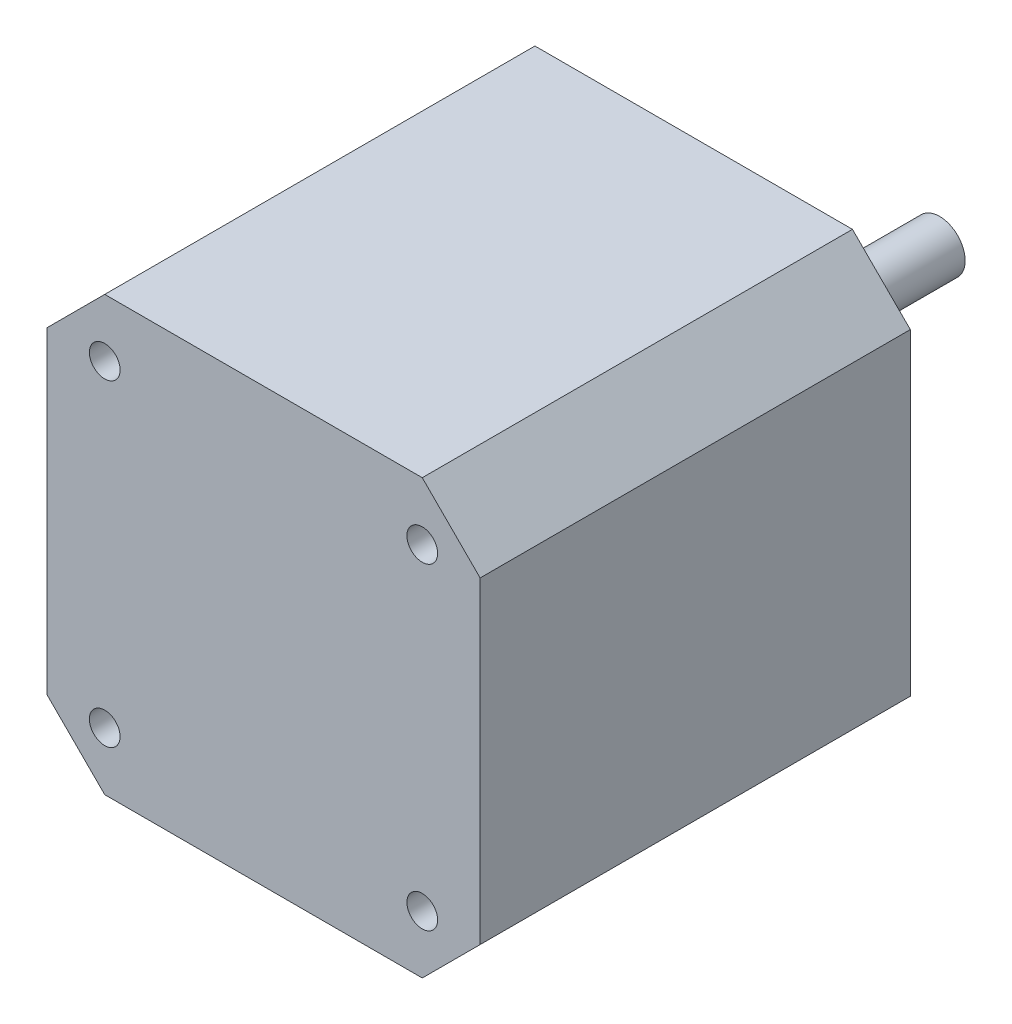
ISO-10303-21;
HEADER;
FILE_DESCRIPTION(('STEP AP214'),'2;1');
FILE_NAME('part.step','',(''),(''),'','','');
FILE_SCHEMA(('AUTOMOTIVE_DESIGN { 1 0 10303 214 1 1 1 1 }'));
ENDSEC;
DATA;
#1=APPLICATION_CONTEXT('core data for automotive mechanical design processes');
#2=APPLICATION_PROTOCOL_DEFINITION('international standard','automotive_design',2000,#1);
#3=PRODUCT_CONTEXT('',#1,'mechanical');
#4=PRODUCT('Part','Part','',(#3));
#5=PRODUCT_RELATED_PRODUCT_CATEGORY('part','',(#4));
#6=PRODUCT_DEFINITION_FORMATION('','',#4);
#7=PRODUCT_DEFINITION_CONTEXT('part definition',#1,'design');
#8=PRODUCT_DEFINITION('design','',#6,#7);
#9=PRODUCT_DEFINITION_SHAPE('','',#8);
#10=(LENGTH_UNIT() NAMED_UNIT(*) SI_UNIT(.MILLI.,.METRE.));
#11=(NAMED_UNIT(*) PLANE_ANGLE_UNIT() SI_UNIT($,.RADIAN.));
#12=(NAMED_UNIT(*) SI_UNIT($,.STERADIAN.) SOLID_ANGLE_UNIT());
#13=UNCERTAINTY_MEASURE_WITH_UNIT(LENGTH_MEASURE(1.E-05),#10,'distance_accuracy_value','');
#14=(GEOMETRIC_REPRESENTATION_CONTEXT(3) GLOBAL_UNCERTAINTY_ASSIGNED_CONTEXT((#13)) GLOBAL_UNIT_ASSIGNED_CONTEXT((#10,
#11,#12)) REPRESENTATION_CONTEXT('',''));
#15=CARTESIAN_POINT('',(0.,0.,0.));
#16=DIRECTION('',(0.,0.,1.));
#17=DIRECTION('',(1.,0.,0.));
#18=AXIS2_PLACEMENT_3D('',#15,#16,#17);
#19=CARTESIAN_POINT('',(0.,0.,42.));
#20=DIRECTION('',(0.,0.,1.));
#21=DIRECTION('',(1.,0.,0.));
#22=AXIS2_PLACEMENT_3D('',#19,#20,#21);
#23=PLANE('',#22);
#24=CARTESIAN_POINT('',(-15.4999999999991,-15.5000000000009,42.));
#25=DIRECTION('',(0.,0.,1.));
#26=DIRECTION('',(1.,0.,0.));
#27=AXIS2_PLACEMENT_3D('',#24,#25,#26);
#28=CIRCLE('',#27,1.50000000000065);
#29=CARTESIAN_POINT('',(-13.9999999999985,-15.5000000000009,42.));
#30=VERTEX_POINT('',#29);
#31=EDGE_CURVE('E192',#30,#30,#28,.T.);
#32=ORIENTED_EDGE('',*,*,#31,.F.);
#33=EDGE_LOOP('',(#32));
#34=FACE_BOUND('',#33,.T.);
#35=CARTESIAN_POINT('',(15.5,15.5,42.));
#36=DIRECTION('',(0.,0.,1.));
#37=DIRECTION('',(1.,0.,0.));
#38=AXIS2_PLACEMENT_3D('',#35,#36,#37);
#39=CIRCLE('',#38,1.5);
#40=CARTESIAN_POINT('',(17.,15.5,42.));
#41=VERTEX_POINT('',#40);
#42=EDGE_CURVE('E138',#41,#41,#39,.T.);
#43=ORIENTED_EDGE('',*,*,#42,.F.);
#44=EDGE_LOOP('',(#43));
#45=FACE_BOUND('',#44,.T.);
#46=DIRECTION('',(-1.,0.,0.));
#47=VECTOR('',#46,1.);
#48=CARTESIAN_POINT('',(-15.5000000000006,21.1499999999994,42.));
#49=LINE('',#48,#47);
#50=CARTESIAN_POINT('',(15.5000000000006,21.1499999999994,42.));
#51=VERTEX_POINT('',#50);
#52=CARTESIAN_POINT('',(-15.5000000000006,21.1499999999994,42.));
#53=VERTEX_POINT('',#52);
#54=EDGE_CURVE('E149',#51,#53,#49,.T.);
#55=ORIENTED_EDGE('',*,*,#54,.T.);
#56=DIRECTION('',(-0.707106781186547,-0.707106781186548,0.));
#57=VECTOR('',#56,1.);
#58=CARTESIAN_POINT('',(-15.5000000000006,21.1499999999994,42.));
#59=LINE('',#58,#57);
#60=CARTESIAN_POINT('',(-21.1499999999993,15.5000000000006,42.));
#61=VERTEX_POINT('',#60);
#62=EDGE_CURVE('E97',#53,#61,#59,.T.);
#63=ORIENTED_EDGE('',*,*,#62,.T.);
#64=DIRECTION('',(0.,-1.,0.));
#65=VECTOR('',#64,1.);
#66=CARTESIAN_POINT('',(-21.1499999999993,-15.5000000000006,42.));
#67=LINE('',#66,#65);
#68=CARTESIAN_POINT('',(-21.1499999999993,-15.5000000000006,42.));
#69=VERTEX_POINT('',#68);
#70=EDGE_CURVE('E164',#61,#69,#67,.T.);
#71=ORIENTED_EDGE('',*,*,#70,.T.);
#72=DIRECTION('',(0.707106781186548,-0.707106781186547,0.));
#73=VECTOR('',#72,1.);
#74=CARTESIAN_POINT('',(-21.1499999999993,-15.5000000000006,42.));
#75=LINE('',#74,#73);
#76=CARTESIAN_POINT('',(-15.5000000000006,-21.1499999999993,42.));
#77=VERTEX_POINT('',#76);
#78=EDGE_CURVE('E177',#69,#77,#75,.T.);
#79=ORIENTED_EDGE('',*,*,#78,.T.);
#80=DIRECTION('',(1.,0.,0.));
#81=VECTOR('',#80,1.);
#82=CARTESIAN_POINT('',(-15.5000000000006,-21.1499999999993,42.));
#83=LINE('',#82,#81);
#84=CARTESIAN_POINT('',(15.5000000000006,-21.1499999999993,42.));
#85=VERTEX_POINT('',#84);
#86=EDGE_CURVE('E116',#77,#85,#83,.T.);
#87=ORIENTED_EDGE('',*,*,#86,.T.);
#88=DIRECTION('',(0.707106781186548,0.707106781186548,0.));
#89=VECTOR('',#88,1.);
#90=CARTESIAN_POINT('',(15.5000000000006,-21.1499999999993,42.));
#91=LINE('',#90,#89);
#92=CARTESIAN_POINT('',(21.1499999999994,-15.5000000000006,42.));
#93=VERTEX_POINT('',#92);
#94=EDGE_CURVE('E110',#85,#93,#91,.T.);
#95=ORIENTED_EDGE('',*,*,#94,.T.);
#96=DIRECTION('',(0.,1.,0.));
#97=VECTOR('',#96,1.);
#98=CARTESIAN_POINT('',(21.1499999999994,-15.5000000000006,42.));
#99=LINE('',#98,#97);
#100=CARTESIAN_POINT('',(21.1499999999994,15.5000000000006,42.));
#101=VERTEX_POINT('',#100);
#102=EDGE_CURVE('E114',#93,#101,#99,.T.);
#103=ORIENTED_EDGE('',*,*,#102,.T.);
#104=DIRECTION('',(-0.707106781186548,0.707106781186547,0.));
#105=VECTOR('',#104,1.);
#106=CARTESIAN_POINT('',(21.1499999999994,15.5000000000006,42.));
#107=LINE('',#106,#105);
#108=EDGE_CURVE('E54',#101,#51,#107,.T.);
#109=ORIENTED_EDGE('',*,*,#108,.T.);
#110=EDGE_LOOP('',(#55,#63,#71,#79,#87,#95,#103,#109));
#111=FACE_BOUND('',#110,.T.);
#112=CARTESIAN_POINT('',(15.5000000000009,-15.5,42.));
#113=DIRECTION('',(0.,0.,1.));
#114=DIRECTION('',(1.,0.,0.));
#115=AXIS2_PLACEMENT_3D('',#112,#113,#114);
#116=CIRCLE('',#115,1.49999999999978);
#117=CARTESIAN_POINT('',(17.0000000000007,-15.5,42.));
#118=VERTEX_POINT('',#117);
#119=EDGE_CURVE('E186',#118,#118,#116,.T.);
#120=ORIENTED_EDGE('',*,*,#119,.F.);
#121=EDGE_LOOP('',(#120));
#122=FACE_BOUND('',#121,.T.);
#123=CARTESIAN_POINT('',(-15.5,15.4999999999991,42.));
#124=DIRECTION('',(0.,0.,1.));
#125=DIRECTION('',(1.,0.,0.));
#126=AXIS2_PLACEMENT_3D('',#123,#124,#125);
#127=CIRCLE('',#126,1.50000000000094);
#128=CARTESIAN_POINT('',(-13.9999999999991,15.4999999999991,42.));
#129=VERTEX_POINT('',#128);
#130=EDGE_CURVE('E198',#129,#129,#127,.T.);
#131=ORIENTED_EDGE('',*,*,#130,.F.);
#132=EDGE_LOOP('',(#131));
#133=FACE_BOUND('',#132,.T.);
#134=ADVANCED_FACE('F37',(#34,#45,#111,#122,#133),#23,.T.);
#135=CARTESIAN_POINT('',(0.,0.,0.));
#136=DIRECTION('',(0.,0.,1.));
#137=DIRECTION('',(1.,0.,0.));
#138=AXIS2_PLACEMENT_3D('',#135,#136,#137);
#139=PLANE('',#138);
#140=CARTESIAN_POINT('',(0.,0.,0.));
#141=DIRECTION('',(0.,0.,1.));
#142=DIRECTION('',(1.,0.,0.));
#143=AXIS2_PLACEMENT_3D('',#140,#141,#142);
#144=CIRCLE('',#143,11.);
#145=CARTESIAN_POINT('',(11.,0.,0.));
#146=VERTEX_POINT('',#145);
#147=EDGE_CURVE('E204',#146,#146,#144,.T.);
#148=ORIENTED_EDGE('',*,*,#147,.T.);
#149=EDGE_LOOP('',(#148));
#150=FACE_BOUND('',#149,.T.);
#151=DIRECTION('',(-1.,0.,0.));
#152=VECTOR('',#151,1.);
#153=CARTESIAN_POINT('',(-15.5000000000006,21.1499999999994,0.));
#154=LINE('',#153,#152);
#155=CARTESIAN_POINT('',(15.5000000000006,21.1499999999994,0.));
#156=VERTEX_POINT('',#155);
#157=CARTESIAN_POINT('',(-15.5000000000006,21.1499999999994,0.));
#158=VERTEX_POINT('',#157);
#159=EDGE_CURVE('E134',#156,#158,#154,.T.);
#160=ORIENTED_EDGE('',*,*,#159,.F.);
#161=DIRECTION('',(-0.707106781186548,0.707106781186547,0.));
#162=VECTOR('',#161,1.);
#163=CARTESIAN_POINT('',(21.1499999999994,15.5000000000006,0.));
#164=LINE('',#163,#162);
#165=CARTESIAN_POINT('',(21.1499999999994,15.5000000000006,0.));
#166=VERTEX_POINT('',#165);
#167=EDGE_CURVE('E89',#166,#156,#164,.T.);
#168=ORIENTED_EDGE('',*,*,#167,.F.);
#169=DIRECTION('',(0.,1.,0.));
#170=VECTOR('',#169,1.);
#171=CARTESIAN_POINT('',(21.1499999999994,-15.5000000000006,0.));
#172=LINE('',#171,#170);
#173=CARTESIAN_POINT('',(21.1499999999994,-15.5000000000006,0.));
#174=VERTEX_POINT('',#173);
#175=EDGE_CURVE('E83',#174,#166,#172,.T.);
#176=ORIENTED_EDGE('',*,*,#175,.F.);
#177=DIRECTION('',(0.707106781186548,0.707106781186548,0.));
#178=VECTOR('',#177,1.);
#179=CARTESIAN_POINT('',(15.5000000000006,-21.1499999999993,0.));
#180=LINE('',#179,#178);
#181=CARTESIAN_POINT('',(15.5000000000006,-21.1499999999993,0.));
#182=VERTEX_POINT('',#181);
#183=EDGE_CURVE('E124',#182,#174,#180,.T.);
#184=ORIENTED_EDGE('',*,*,#183,.F.);
#185=DIRECTION('',(1.,0.,0.));
#186=VECTOR('',#185,1.);
#187=CARTESIAN_POINT('',(-15.5000000000006,-21.1499999999993,0.));
#188=LINE('',#187,#186);
#189=CARTESIAN_POINT('',(-15.5000000000006,-21.1499999999993,0.));
#190=VERTEX_POINT('',#189);
#191=EDGE_CURVE('E144',#190,#182,#188,.T.);
#192=ORIENTED_EDGE('',*,*,#191,.F.);
#193=DIRECTION('',(0.707106781186548,-0.707106781186547,0.));
#194=VECTOR('',#193,1.);
#195=CARTESIAN_POINT('',(-21.1499999999993,-15.5000000000006,0.));
#196=LINE('',#195,#194);
#197=CARTESIAN_POINT('',(-21.1499999999993,-15.5000000000006,0.));
#198=VERTEX_POINT('',#197);
#199=EDGE_CURVE('E142',#198,#190,#196,.T.);
#200=ORIENTED_EDGE('',*,*,#199,.F.);
#201=DIRECTION('',(0.,-1.,0.));
#202=VECTOR('',#201,1.);
#203=CARTESIAN_POINT('',(-21.1499999999993,-15.5000000000006,0.));
#204=LINE('',#203,#202);
#205=CARTESIAN_POINT('',(-21.1499999999993,15.5000000000006,0.));
#206=VERTEX_POINT('',#205);
#207=EDGE_CURVE('E140',#206,#198,#204,.T.);
#208=ORIENTED_EDGE('',*,*,#207,.F.);
#209=DIRECTION('',(-0.707106781186547,-0.707106781186548,0.));
#210=VECTOR('',#209,1.);
#211=CARTESIAN_POINT('',(-15.5000000000006,21.1499999999994,0.));
#212=LINE('',#211,#210);
#213=EDGE_CURVE('E137',#158,#206,#212,.T.);
#214=ORIENTED_EDGE('',*,*,#213,.F.);
#215=EDGE_LOOP('',(#160,#168,#176,#184,#192,#200,#208,#214));
#216=FACE_BOUND('',#215,.T.);
#217=CARTESIAN_POINT('',(15.5,15.5,0.));
#218=DIRECTION('',(0.,0.,1.));
#219=DIRECTION('',(1.,0.,0.));
#220=AXIS2_PLACEMENT_3D('',#217,#218,#219);
#221=CIRCLE('',#220,1.5);
#222=CARTESIAN_POINT('',(17.,15.5,0.));
#223=VERTEX_POINT('',#222);
#224=EDGE_CURVE('E183',#223,#223,#221,.T.);
#225=ORIENTED_EDGE('',*,*,#224,.T.);
#226=EDGE_LOOP('',(#225));
#227=FACE_BOUND('',#226,.T.);
#228=CARTESIAN_POINT('',(15.5000000000009,-15.5,0.));
#229=DIRECTION('',(0.,0.,1.));
#230=DIRECTION('',(1.,0.,0.));
#231=AXIS2_PLACEMENT_3D('',#228,#229,#230);
#232=CIRCLE('',#231,1.49999999999978);
#233=CARTESIAN_POINT('',(17.0000000000007,-15.5,0.));
#234=VERTEX_POINT('',#233);
#235=EDGE_CURVE('E189',#234,#234,#232,.T.);
#236=ORIENTED_EDGE('',*,*,#235,.T.);
#237=EDGE_LOOP('',(#236));
#238=FACE_BOUND('',#237,.T.);
#239=CARTESIAN_POINT('',(-15.4999999999991,-15.5000000000009,0.));
#240=DIRECTION('',(0.,0.,1.));
#241=DIRECTION('',(1.,0.,0.));
#242=AXIS2_PLACEMENT_3D('',#239,#240,#241);
#243=CIRCLE('',#242,1.50000000000065);
#244=CARTESIAN_POINT('',(-13.9999999999985,-15.5000000000009,0.));
#245=VERTEX_POINT('',#244);
#246=EDGE_CURVE('E195',#245,#245,#243,.T.);
#247=ORIENTED_EDGE('',*,*,#246,.T.);
#248=EDGE_LOOP('',(#247));
#249=FACE_BOUND('',#248,.T.);
#250=CARTESIAN_POINT('',(-15.5,15.4999999999991,0.));
#251=DIRECTION('',(0.,0.,1.));
#252=DIRECTION('',(1.,0.,0.));
#253=AXIS2_PLACEMENT_3D('',#250,#251,#252);
#254=CIRCLE('',#253,1.50000000000094);
#255=CARTESIAN_POINT('',(-13.9999999999991,15.4999999999991,0.));
#256=VERTEX_POINT('',#255);
#257=EDGE_CURVE('E201',#256,#256,#254,.T.);
#258=ORIENTED_EDGE('',*,*,#257,.T.);
#259=EDGE_LOOP('',(#258));
#260=FACE_BOUND('',#259,.T.);
#261=ADVANCED_FACE('F168',(#150,#216,#227,#238,#249,#260),#139,.F.);
#262=CARTESIAN_POINT('',(-15.5000000000006,21.1499999999994,42.));
#263=DIRECTION('',(0.,-1.,0.));
#264=DIRECTION('',(1.,0.,0.));
#265=AXIS2_PLACEMENT_3D('',#262,#263,#264);
#266=PLANE('',#265);
#267=ORIENTED_EDGE('',*,*,#159,.T.);
#268=DIRECTION('',(0.,0.,-1.));
#269=VECTOR('',#268,1.);
#270=CARTESIAN_POINT('',(-15.5000000000006,21.1499999999994,42.));
#271=LINE('',#270,#269);
#272=EDGE_CURVE('E11',#53,#158,#271,.T.);
#273=ORIENTED_EDGE('',*,*,#272,.F.);
#274=ORIENTED_EDGE('',*,*,#54,.F.);
#275=DIRECTION('',(0.,0.,-1.));
#276=VECTOR('',#275,1.);
#277=CARTESIAN_POINT('',(15.5000000000006,21.1499999999994,42.));
#278=LINE('',#277,#276);
#279=EDGE_CURVE('E130',#51,#156,#278,.T.);
#280=ORIENTED_EDGE('',*,*,#279,.T.);
#281=EDGE_LOOP('',(#267,#273,#274,#280));
#282=FACE_BOUND('',#281,.T.);
#283=ADVANCED_FACE('F39',(#282),#266,.F.);
#284=CARTESIAN_POINT('',(-15.5000000000006,21.1499999999994,42.));
#285=DIRECTION('',(0.707106781186548,-0.707106781186547,0.));
#286=DIRECTION('',(0.707106781186547,0.707106781186548,0.));
#287=AXIS2_PLACEMENT_3D('',#284,#285,#286);
#288=PLANE('',#287);
#289=ORIENTED_EDGE('',*,*,#213,.T.);
#290=DIRECTION('',(0.,0.,-1.));
#291=VECTOR('',#290,1.);
#292=CARTESIAN_POINT('',(-21.1499999999993,15.5000000000006,42.));
#293=LINE('',#292,#291);
#294=EDGE_CURVE('E46',#61,#206,#293,.T.);
#295=ORIENTED_EDGE('',*,*,#294,.F.);
#296=ORIENTED_EDGE('',*,*,#62,.F.);
#297=ORIENTED_EDGE('',*,*,#272,.T.);
#298=EDGE_LOOP('',(#289,#295,#296,#297));
#299=FACE_BOUND('',#298,.T.);
#300=ADVANCED_FACE('F268',(#299),#288,.F.);
#301=CARTESIAN_POINT('',(-21.1499999999993,-15.5000000000006,42.));
#302=DIRECTION('',(1.,0.,0.));
#303=DIRECTION('',(0.,0.,-1.));
#304=AXIS2_PLACEMENT_3D('',#301,#302,#303);
#305=PLANE('',#304);
#306=ORIENTED_EDGE('',*,*,#207,.T.);
#307=DIRECTION('',(0.,0.,-1.));
#308=VECTOR('',#307,1.);
#309=CARTESIAN_POINT('',(-21.1499999999993,-15.5000000000006,42.));
#310=LINE('',#309,#308);
#311=EDGE_CURVE('E156',#69,#198,#310,.T.);
#312=ORIENTED_EDGE('',*,*,#311,.F.);
#313=ORIENTED_EDGE('',*,*,#70,.F.);
#314=ORIENTED_EDGE('',*,*,#294,.T.);
#315=EDGE_LOOP('',(#306,#312,#313,#314));
#316=FACE_BOUND('',#315,.T.);
#317=ADVANCED_FACE('F162',(#316),#305,.F.);
#318=CARTESIAN_POINT('',(-21.1499999999993,-15.5000000000006,42.));
#319=DIRECTION('',(0.707106781186547,0.707106781186548,0.));
#320=DIRECTION('',(-0.707106781186548,0.707106781186547,0.));
#321=AXIS2_PLACEMENT_3D('',#318,#319,#320);
#322=PLANE('',#321);
#323=ORIENTED_EDGE('',*,*,#199,.T.);
#324=DIRECTION('',(0.,0.,-1.));
#325=VECTOR('',#324,1.);
#326=CARTESIAN_POINT('',(-15.5000000000006,-21.1499999999993,42.));
#327=LINE('',#326,#325);
#328=EDGE_CURVE('E153',#77,#190,#327,.T.);
#329=ORIENTED_EDGE('',*,*,#328,.F.);
#330=ORIENTED_EDGE('',*,*,#78,.F.);
#331=ORIENTED_EDGE('',*,*,#311,.T.);
#332=EDGE_LOOP('',(#323,#329,#330,#331));
#333=FACE_BOUND('',#332,.T.);
#334=ADVANCED_FACE('F173',(#333),#322,.F.);
#335=CARTESIAN_POINT('',(-15.5000000000006,-21.1499999999993,42.));
#336=DIRECTION('',(0.,1.,0.));
#337=DIRECTION('',(-1.,0.,0.));
#338=AXIS2_PLACEMENT_3D('',#335,#336,#337);
#339=PLANE('',#338);
#340=ORIENTED_EDGE('',*,*,#191,.T.);
#341=DIRECTION('',(0.,0.,-1.));
#342=VECTOR('',#341,1.);
#343=CARTESIAN_POINT('',(15.5000000000006,-21.1499999999993,42.));
#344=LINE('',#343,#342);
#345=EDGE_CURVE('E125',#85,#182,#344,.T.);
#346=ORIENTED_EDGE('',*,*,#345,.F.);
#347=ORIENTED_EDGE('',*,*,#86,.F.);
#348=ORIENTED_EDGE('',*,*,#328,.T.);
#349=EDGE_LOOP('',(#340,#346,#347,#348));
#350=FACE_BOUND('',#349,.T.);
#351=ADVANCED_FACE('F176',(#350),#339,.F.);
#352=CARTESIAN_POINT('',(15.5000000000006,-21.1499999999993,42.));
#353=DIRECTION('',(-0.707106781186548,0.707106781186548,0.));
#354=DIRECTION('',(-0.707106781186548,-0.707106781186548,0.));
#355=AXIS2_PLACEMENT_3D('',#352,#353,#354);
#356=PLANE('',#355);
#357=ORIENTED_EDGE('',*,*,#183,.T.);
#358=DIRECTION('',(0.,0.,-1.));
#359=VECTOR('',#358,1.);
#360=CARTESIAN_POINT('',(21.1499999999994,-15.5000000000006,42.));
#361=LINE('',#360,#359);
#362=EDGE_CURVE('E121',#93,#174,#361,.T.);
#363=ORIENTED_EDGE('',*,*,#362,.F.);
#364=ORIENTED_EDGE('',*,*,#94,.F.);
#365=ORIENTED_EDGE('',*,*,#345,.T.);
#366=EDGE_LOOP('',(#357,#363,#364,#365));
#367=FACE_BOUND('',#366,.T.);
#368=ADVANCED_FACE('F122',(#367),#356,.F.);
#369=CARTESIAN_POINT('',(21.1499999999994,-15.5000000000006,42.));
#370=DIRECTION('',(-1.,0.,0.));
#371=DIRECTION('',(0.,-1.,0.));
#372=AXIS2_PLACEMENT_3D('',#369,#370,#371);
#373=PLANE('',#372);
#374=ORIENTED_EDGE('',*,*,#175,.T.);
#375=DIRECTION('',(0.,0.,-1.));
#376=VECTOR('',#375,1.);
#377=CARTESIAN_POINT('',(21.1499999999994,15.5000000000006,42.));
#378=LINE('',#377,#376);
#379=EDGE_CURVE('E126',#101,#166,#378,.T.);
#380=ORIENTED_EDGE('',*,*,#379,.F.);
#381=ORIENTED_EDGE('',*,*,#102,.F.);
#382=ORIENTED_EDGE('',*,*,#362,.T.);
#383=EDGE_LOOP('',(#374,#380,#381,#382));
#384=FACE_BOUND('',#383,.T.);
#385=ADVANCED_FACE('F128',(#384),#373,.F.);
#386=CARTESIAN_POINT('',(21.1499999999994,15.5000000000006,42.));
#387=DIRECTION('',(-0.707106781186547,-0.707106781186548,0.));
#388=DIRECTION('',(0.707106781186548,-0.707106781186547,0.));
#389=AXIS2_PLACEMENT_3D('',#386,#387,#388);
#390=PLANE('',#389);
#391=ORIENTED_EDGE('',*,*,#167,.T.);
#392=ORIENTED_EDGE('',*,*,#279,.F.);
#393=ORIENTED_EDGE('',*,*,#108,.F.);
#394=ORIENTED_EDGE('',*,*,#379,.T.);
#395=EDGE_LOOP('',(#391,#392,#393,#394));
#396=FACE_BOUND('',#395,.T.);
#397=ADVANCED_FACE('F256',(#396),#390,.F.);
#398=CARTESIAN_POINT('',(15.5,15.5,42.));
#399=DIRECTION('',(0.,0.,-1.));
#400=DIRECTION('',(-1.,0.,0.));
#401=AXIS2_PLACEMENT_3D('',#398,#399,#400);
#402=CYLINDRICAL_SURFACE('',#401,1.5);
#403=ORIENTED_EDGE('',*,*,#42,.T.);
#404=EDGE_LOOP('',(#403));
#405=FACE_BOUND('',#404,.T.);
#406=ORIENTED_EDGE('',*,*,#224,.F.);
#407=EDGE_LOOP('',(#406));
#408=FACE_BOUND('',#407,.T.);
#409=ADVANCED_FACE('F253',(#405,#408),#402,.F.);
#410=CARTESIAN_POINT('',(15.5000000000009,-15.5,42.));
#411=DIRECTION('',(0.,0.,-1.));
#412=DIRECTION('',(-1.,0.,0.));
#413=AXIS2_PLACEMENT_3D('',#410,#411,#412);
#414=CYLINDRICAL_SURFACE('',#413,1.49999999999978);
#415=ORIENTED_EDGE('',*,*,#119,.T.);
#416=EDGE_LOOP('',(#415));
#417=FACE_BOUND('',#416,.T.);
#418=ORIENTED_EDGE('',*,*,#235,.F.);
#419=EDGE_LOOP('',(#418));
#420=FACE_BOUND('',#419,.T.);
#421=ADVANCED_FACE('F321',(#417,#420),#414,.F.);
#422=CARTESIAN_POINT('',(-15.4999999999991,-15.5000000000009,42.));
#423=DIRECTION('',(0.,0.,-1.));
#424=DIRECTION('',(-1.,0.,0.));
#425=AXIS2_PLACEMENT_3D('',#422,#423,#424);
#426=CYLINDRICAL_SURFACE('',#425,1.50000000000065);
#427=ORIENTED_EDGE('',*,*,#31,.T.);
#428=EDGE_LOOP('',(#427));
#429=FACE_BOUND('',#428,.T.);
#430=ORIENTED_EDGE('',*,*,#246,.F.);
#431=EDGE_LOOP('',(#430));
#432=FACE_BOUND('',#431,.T.);
#433=ADVANCED_FACE('F316',(#429,#432),#426,.F.);
#434=CARTESIAN_POINT('',(-15.5,15.4999999999991,42.));
#435=DIRECTION('',(0.,0.,-1.));
#436=DIRECTION('',(-1.,0.,0.));
#437=AXIS2_PLACEMENT_3D('',#434,#435,#436);
#438=CYLINDRICAL_SURFACE('',#437,1.50000000000094);
#439=ORIENTED_EDGE('',*,*,#130,.T.);
#440=EDGE_LOOP('',(#439));
#441=FACE_BOUND('',#440,.T.);
#442=ORIENTED_EDGE('',*,*,#257,.F.);
#443=EDGE_LOOP('',(#442));
#444=FACE_BOUND('',#443,.T.);
#445=ADVANCED_FACE('F239',(#441,#444),#438,.F.);
#446=CARTESIAN_POINT('',(0.,0.,0.));
#447=DIRECTION('',(0.,0.,1.));
#448=DIRECTION('',(1.,0.,0.));
#449=AXIS2_PLACEMENT_3D('',#446,#447,#448);
#450=CYLINDRICAL_SURFACE('',#449,11.);
#451=ORIENTED_EDGE('',*,*,#147,.F.);
#452=EDGE_LOOP('',(#451));
#453=FACE_BOUND('',#452,.T.);
#454=CARTESIAN_POINT('',(0.,0.,-2.));
#455=DIRECTION('',(0.,0.,1.));
#456=DIRECTION('',(1.,0.,0.));
#457=AXIS2_PLACEMENT_3D('',#454,#455,#456);
#458=CIRCLE('',#457,11.);
#459=CARTESIAN_POINT('',(11.,0.,-2.));
#460=VERTEX_POINT('',#459);
#461=EDGE_CURVE('E215',#460,#460,#458,.T.);
#462=ORIENTED_EDGE('',*,*,#461,.T.);
#463=EDGE_LOOP('',(#462));
#464=FACE_BOUND('',#463,.T.);
#465=ADVANCED_FACE('F219',(#453,#464),#450,.T.);
#466=CARTESIAN_POINT('',(0.,0.,-24.));
#467=DIRECTION('',(0.,0.,1.));
#468=DIRECTION('',(1.,0.,0.));
#469=AXIS2_PLACEMENT_3D('',#466,#467,#468);
#470=PLANE('',#469);
#471=CARTESIAN_POINT('',(0.,0.,-24.));
#472=DIRECTION('',(0.,0.,1.));
#473=DIRECTION('',(1.,0.,0.));
#474=AXIS2_PLACEMENT_3D('',#471,#472,#473);
#475=CIRCLE('',#474,2.5);
#476=CARTESIAN_POINT('',(2.5,0.,-24.));
#477=VERTEX_POINT('',#476);
#478=EDGE_CURVE('E209',#477,#477,#475,.T.);
#479=ORIENTED_EDGE('',*,*,#478,.F.);
#480=EDGE_LOOP('',(#479));
#481=FACE_BOUND('',#480,.T.);
#482=ADVANCED_FACE('F230',(#481),#470,.F.);
#483=CARTESIAN_POINT('',(0.,0.,0.));
#484=DIRECTION('',(0.,0.,1.));
#485=DIRECTION('',(1.,0.,0.));
#486=AXIS2_PLACEMENT_3D('',#483,#484,#485);
#487=CYLINDRICAL_SURFACE('',#486,2.5);
#488=CARTESIAN_POINT('',(0.,0.,-2.));
#489=DIRECTION('',(0.,0.,1.));
#490=DIRECTION('',(1.,0.,0.));
#491=AXIS2_PLACEMENT_3D('',#488,#489,#490);
#492=CIRCLE('',#491,2.5);
#493=CARTESIAN_POINT('',(2.5,0.,-2.));
#494=VERTEX_POINT('',#493);
#495=EDGE_CURVE('E212',#494,#494,#492,.T.);
#496=ORIENTED_EDGE('',*,*,#495,.F.);
#497=EDGE_LOOP('',(#496));
#498=FACE_BOUND('',#497,.T.);
#499=ORIENTED_EDGE('',*,*,#478,.T.);
#500=EDGE_LOOP('',(#499));
#501=FACE_BOUND('',#500,.T.);
#502=ADVANCED_FACE('F224',(#498,#501),#487,.T.);
#503=CARTESIAN_POINT('',(0.,2.5,-2.));
#504=DIRECTION('',(0.,0.,1.));
#505=DIRECTION('',(1.,0.,0.));
#506=AXIS2_PLACEMENT_3D('',#503,#504,#505);
#507=PLANE('',#506);
#508=ORIENTED_EDGE('',*,*,#461,.F.);
#509=EDGE_LOOP('',(#508));
#510=FACE_BOUND('',#509,.T.);
#511=ORIENTED_EDGE('',*,*,#495,.T.);
#512=EDGE_LOOP('',(#511));
#513=FACE_BOUND('',#512,.T.);
#514=ADVANCED_FACE('F221',(#510,#513),#507,.F.);
#515=CLOSED_SHELL('',(#134,#261,#283,#300,#317,#334,#351,#368,#385,#397,#409,#421,#433,#445,
#465,#482,#502,#514));
#516=MANIFOLD_SOLID_BREP('B2',#515);
#517=ADVANCED_BREP_SHAPE_REPRESENTATION('',(#18,#516),#14);
#518=SHAPE_DEFINITION_REPRESENTATION(#9,#517);
ENDSEC;
END-ISO-10303-21;
